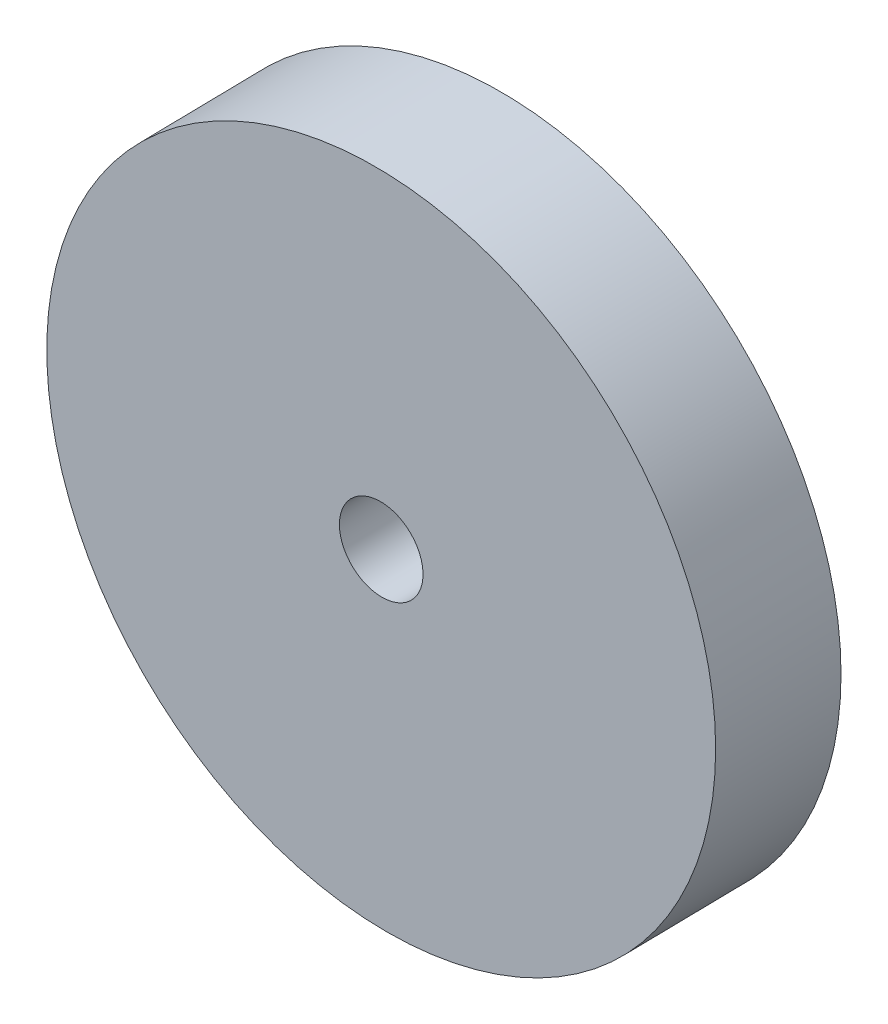
ISO-10303-21;
HEADER;
FILE_DESCRIPTION(('STEP AP214'),'2;1');
FILE_NAME('part.step','',(''),(''),'','','');
FILE_SCHEMA(('AUTOMOTIVE_DESIGN { 1 0 10303 214 1 1 1 1 }'));
ENDSEC;
DATA;
#1=APPLICATION_CONTEXT('core data for automotive mechanical design processes');
#2=APPLICATION_PROTOCOL_DEFINITION('international standard','automotive_design',2000,#1);
#3=PRODUCT_CONTEXT('',#1,'mechanical');
#4=PRODUCT('Part','Part','',(#3));
#5=PRODUCT_RELATED_PRODUCT_CATEGORY('part','',(#4));
#6=PRODUCT_DEFINITION_FORMATION('','',#4);
#7=PRODUCT_DEFINITION_CONTEXT('part definition',#1,'design');
#8=PRODUCT_DEFINITION('design','',#6,#7);
#9=PRODUCT_DEFINITION_SHAPE('','',#8);
#10=(LENGTH_UNIT() NAMED_UNIT(*) SI_UNIT(.MILLI.,.METRE.));
#11=(NAMED_UNIT(*) PLANE_ANGLE_UNIT() SI_UNIT($,.RADIAN.));
#12=(NAMED_UNIT(*) SI_UNIT($,.STERADIAN.) SOLID_ANGLE_UNIT());
#13=UNCERTAINTY_MEASURE_WITH_UNIT(LENGTH_MEASURE(1.E-05),#10,'distance_accuracy_value','');
#14=(GEOMETRIC_REPRESENTATION_CONTEXT(3) GLOBAL_UNCERTAINTY_ASSIGNED_CONTEXT((#13)) GLOBAL_UNIT_ASSIGNED_CONTEXT((#10,
#11,#12)) REPRESENTATION_CONTEXT('',''));
#15=CARTESIAN_POINT('',(0.,0.,0.));
#16=DIRECTION('',(0.,0.,1.));
#17=DIRECTION('',(1.,0.,0.));
#18=AXIS2_PLACEMENT_3D('',#15,#16,#17);
#19=CARTESIAN_POINT('',(0.,1.4738213903435,1.49977154273457));
#20=DIRECTION('',(0.,-0.0174524064376661,0.999847695156385));
#21=DIRECTION('',(0.,-0.999847695156385,-0.0174524064376661));
#22=AXIS2_PLACEMENT_3D('',#19,#20,#21);
#23=PLANE('',#22);
#24=CARTESIAN_POINT('',(0.,1.4738213903435,1.49977154273457));
#25=DIRECTION('',(0.,-0.0174524064376661,0.999847695156385));
#26=DIRECTION('',(0.,-0.999847695156385,-0.0174524064376661));
#27=AXIS2_PLACEMENT_3D('',#24,#25,#26);
#28=CIRCLE('',#27,8.);
#29=CARTESIAN_POINT('',(0.,-6.52496017090758,1.36015229123325));
#30=VERTEX_POINT('',#29);
#31=EDGE_CURVE('E10',#30,#30,#28,.T.);
#32=ORIENTED_EDGE('',*,*,#31,.T.);
#33=EDGE_LOOP('',(#32));
#34=FACE_BOUND('',#33,.T.);
#35=CARTESIAN_POINT('',(0.,1.4738213903435,1.49977154273457));
#36=DIRECTION('',(0.,-0.0174524064376661,0.999847695156385));
#37=DIRECTION('',(0.,-0.999847695156385,-0.0174524064376661));
#38=AXIS2_PLACEMENT_3D('',#35,#36,#37);
#39=CIRCLE('',#38,1.);
#40=CARTESIAN_POINT('',(0.,0.473973695187116,1.48231913629691));
#41=VERTEX_POINT('',#40);
#42=EDGE_CURVE('E43',#41,#41,#39,.T.);
#43=ORIENTED_EDGE('',*,*,#42,.F.);
#44=EDGE_LOOP('',(#43));
#45=FACE_BOUND('',#44,.T.);
#46=ADVANCED_FACE('F32',(#34,#45),#23,.T.);
#47=CARTESIAN_POINT('',(0.,1.5261786096565,-1.49977154273458));
#48=DIRECTION('',(0.,-0.0174524064376661,0.999847695156385));
#49=DIRECTION('',(0.,-0.999847695156385,-0.0174524064376661));
#50=AXIS2_PLACEMENT_3D('',#47,#48,#49);
#51=PLANE('',#50);
#52=CARTESIAN_POINT('',(0.,1.5261786096565,-1.49977154273458));
#53=DIRECTION('',(0.,-0.0174524064376661,0.999847695156385));
#54=DIRECTION('',(0.,-0.999847695156385,-0.0174524064376661));
#55=AXIS2_PLACEMENT_3D('',#52,#53,#54);
#56=CIRCLE('',#55,8.);
#57=CARTESIAN_POINT('',(0.,-6.47260295159458,-1.63939079423591));
#58=VERTEX_POINT('',#57);
#59=EDGE_CURVE('E36',#58,#58,#56,.T.);
#60=ORIENTED_EDGE('',*,*,#59,.F.);
#61=EDGE_LOOP('',(#60));
#62=FACE_BOUND('',#61,.T.);
#63=CARTESIAN_POINT('',(0.,1.5261786096565,-1.49977154273458));
#64=DIRECTION('',(0.,-0.0174524064376661,0.999847695156385));
#65=DIRECTION('',(0.,-0.999847695156385,-0.0174524064376661));
#66=AXIS2_PLACEMENT_3D('',#63,#64,#65);
#67=CIRCLE('',#66,1.);
#68=CARTESIAN_POINT('',(0.,0.526330914500115,-1.51722394917225));
#69=VERTEX_POINT('',#68);
#70=EDGE_CURVE('E45',#69,#69,#67,.T.);
#71=ORIENTED_EDGE('',*,*,#70,.T.);
#72=EDGE_LOOP('',(#71));
#73=FACE_BOUND('',#72,.T.);
#74=ADVANCED_FACE('F55',(#62,#73),#51,.F.);
#75=CARTESIAN_POINT('',(0.,1.4738213903435,1.49977154273457));
#76=DIRECTION('',(0.,0.0174524064376661,-0.999847695156385));
#77=DIRECTION('',(0.,0.999847695156385,0.0174524064376661));
#78=AXIS2_PLACEMENT_3D('',#75,#76,#77);
#79=CYLINDRICAL_SURFACE('',#78,8.);
#80=ORIENTED_EDGE('',*,*,#31,.F.);
#81=EDGE_LOOP('',(#80));
#82=FACE_BOUND('',#81,.T.);
#83=ORIENTED_EDGE('',*,*,#59,.T.);
#84=EDGE_LOOP('',(#83));
#85=FACE_BOUND('',#84,.T.);
#86=ADVANCED_FACE('F34',(#82,#85),#79,.T.);
#87=CARTESIAN_POINT('',(0.,1.4738213903435,1.49977154273457));
#88=DIRECTION('',(0.,0.0174524064376661,-0.999847695156385));
#89=DIRECTION('',(0.,0.999847695156385,0.0174524064376661));
#90=AXIS2_PLACEMENT_3D('',#87,#88,#89);
#91=CYLINDRICAL_SURFACE('',#90,1.);
#92=ORIENTED_EDGE('',*,*,#42,.T.);
#93=EDGE_LOOP('',(#92));
#94=FACE_BOUND('',#93,.T.);
#95=ORIENTED_EDGE('',*,*,#70,.F.);
#96=EDGE_LOOP('',(#95));
#97=FACE_BOUND('',#96,.T.);
#98=ADVANCED_FACE('F51',(#94,#97),#91,.F.);
#99=CLOSED_SHELL('',(#46,#74,#86,#98));
#100=MANIFOLD_SOLID_BREP('B2',#99);
#101=ADVANCED_BREP_SHAPE_REPRESENTATION('',(#18,#100),#14);
#102=SHAPE_DEFINITION_REPRESENTATION(#9,#101);
ENDSEC;
END-ISO-10303-21;
